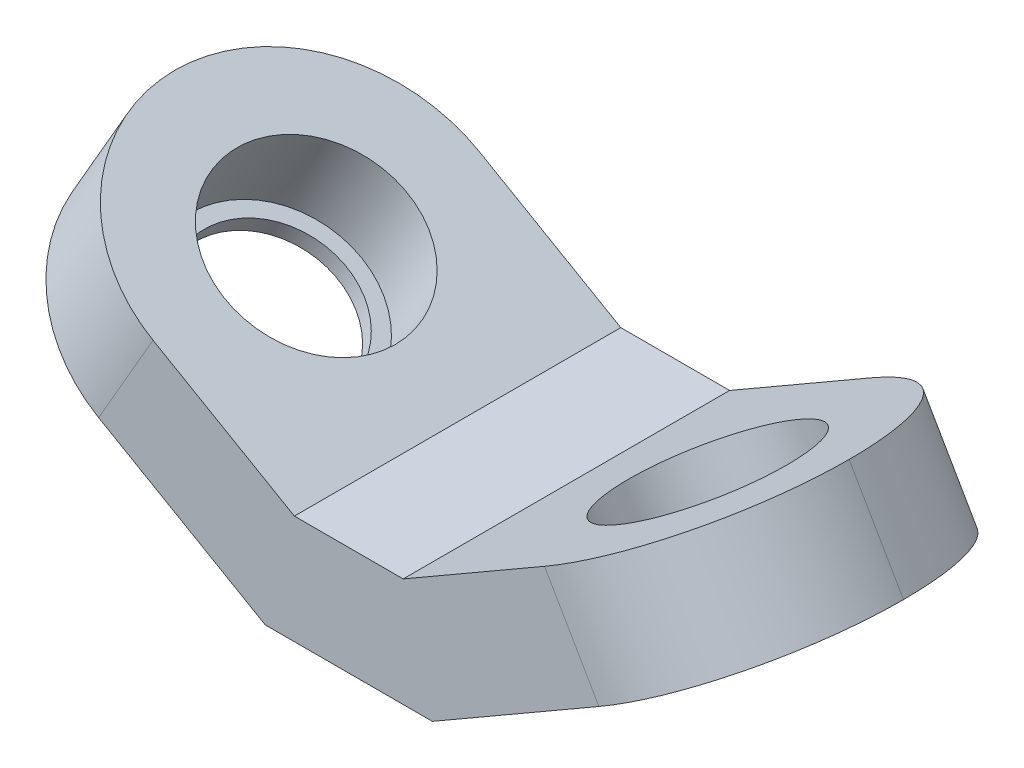
ISO-10303-21;
HEADER;
FILE_DESCRIPTION(('STEP AP214'),'2;1');
FILE_NAME('part.step','',(''),(''),'','','');
FILE_SCHEMA(('AUTOMOTIVE_DESIGN { 1 0 10303 214 1 1 1 1 }'));
ENDSEC;
DATA;
#1=APPLICATION_CONTEXT('core data for automotive mechanical design processes');
#2=APPLICATION_PROTOCOL_DEFINITION('international standard','automotive_design',2000,#1);
#3=PRODUCT_CONTEXT('',#1,'mechanical');
#4=PRODUCT('Part','Part','',(#3));
#5=PRODUCT_RELATED_PRODUCT_CATEGORY('part','',(#4));
#6=PRODUCT_DEFINITION_FORMATION('','',#4);
#7=PRODUCT_DEFINITION_CONTEXT('part definition',#1,'design');
#8=PRODUCT_DEFINITION('design','',#6,#7);
#9=PRODUCT_DEFINITION_SHAPE('','',#8);
#10=(LENGTH_UNIT() NAMED_UNIT(*) SI_UNIT(.MILLI.,.METRE.));
#11=(NAMED_UNIT(*) PLANE_ANGLE_UNIT() SI_UNIT($,.RADIAN.));
#12=(NAMED_UNIT(*) SI_UNIT($,.STERADIAN.) SOLID_ANGLE_UNIT());
#13=UNCERTAINTY_MEASURE_WITH_UNIT(LENGTH_MEASURE(1.E-05),#10,'distance_accuracy_value','');
#14=(GEOMETRIC_REPRESENTATION_CONTEXT(3) GLOBAL_UNCERTAINTY_ASSIGNED_CONTEXT((#13)) GLOBAL_UNIT_ASSIGNED_CONTEXT((#10,
#11,#12)) REPRESENTATION_CONTEXT('',''));
#15=CARTESIAN_POINT('',(0.,0.,0.));
#16=DIRECTION('',(0.,0.,1.));
#17=DIRECTION('',(1.,0.,0.));
#18=AXIS2_PLACEMENT_3D('',#15,#16,#17);
#19=CARTESIAN_POINT('',(7.67949192431122,0.,7.5));
#20=DIRECTION('',(0.,1.,0.));
#21=DIRECTION('',(-1.,0.,0.));
#22=AXIS2_PLACEMENT_3D('',#19,#20,#21);
#23=PLANE('',#22);
#24=DIRECTION('',(1.,0.,0.));
#25=VECTOR('',#24,1.);
#26=CARTESIAN_POINT('',(7.67949192431122,0.,-7.5));
#27=LINE('',#26,#25);
#28=CARTESIAN_POINT('',(0.,0.,-7.5));
#29=VERTEX_POINT('',#28);
#30=CARTESIAN_POINT('',(7.67949192431122,0.,-7.5));
#31=VERTEX_POINT('',#30);
#32=EDGE_CURVE('E141',#29,#31,#27,.T.);
#33=ORIENTED_EDGE('',*,*,#32,.T.);
#34=DIRECTION('',(0.,0.,-1.));
#35=VECTOR('',#34,1.);
#36=CARTESIAN_POINT('',(7.67949192431122,0.,7.5));
#37=LINE('',#36,#35);
#38=CARTESIAN_POINT('',(7.67949192431122,0.,7.5));
#39=VERTEX_POINT('',#38);
#40=EDGE_CURVE('E123',#39,#31,#37,.T.);
#41=ORIENTED_EDGE('',*,*,#40,.F.);
#42=DIRECTION('',(1.,0.,0.));
#43=VECTOR('',#42,1.);
#44=CARTESIAN_POINT('',(7.67949192431122,0.,7.5));
#45=LINE('',#44,#43);
#46=CARTESIAN_POINT('',(0.,0.,7.5));
#47=VERTEX_POINT('',#46);
#48=EDGE_CURVE('E130',#47,#39,#45,.T.);
#49=ORIENTED_EDGE('',*,*,#48,.F.);
#50=DIRECTION('',(0.,0.,-1.));
#51=VECTOR('',#50,1.);
#52=CARTESIAN_POINT('',(0.,0.,7.5));
#53=LINE('',#52,#51);
#54=EDGE_CURVE('E201',#47,#29,#53,.T.);
#55=ORIENTED_EDGE('',*,*,#54,.T.);
#56=EDGE_LOOP('',(#33,#41,#49,#55));
#57=FACE_BOUND('',#56,.T.);
#58=ADVANCED_FACE('F39',(#57),#23,.F.);
#59=CARTESIAN_POINT('',(21.8301270189222,8.16987298107784,7.5));
#60=DIRECTION('',(-0.500000000000001,0.866025403784438,0.));
#61=DIRECTION('',(-0.866025403784438,-0.500000000000001,0.));
#62=AXIS2_PLACEMENT_3D('',#59,#60,#61);
#63=PLANE('',#62);
#64=DIRECTION('',(0.866025403784438,0.500000000000001,0.));
#65=VECTOR('',#64,1.);
#66=CARTESIAN_POINT('',(21.8301270189222,8.16987298107784,-7.5));
#67=LINE('',#66,#65);
#68=CARTESIAN_POINT('',(15.3349364905389,4.41987298107783,-7.5));
#69=VERTEX_POINT('',#68);
#70=EDGE_CURVE('E203',#31,#69,#67,.T.);
#71=ORIENTED_EDGE('',*,*,#70,.T.);
#72=CARTESIAN_POINT('',(15.3349364905389,4.41987298107783,0.));
#73=DIRECTION('',(-0.500000000000001,0.866025403784438,0.));
#74=DIRECTION('',(-0.866025403784438,-0.500000000000001,0.));
#75=AXIS2_PLACEMENT_3D('',#72,#73,#74);
#76=CIRCLE('',#75,7.5);
#77=CARTESIAN_POINT('',(21.8301270189222,8.16987298107784,0.));
#78=VERTEX_POINT('',#77);
#79=EDGE_CURVE('E165',#69,#78,#76,.F.);
#80=ORIENTED_EDGE('',*,*,#79,.T.);
#81=CARTESIAN_POINT('',(15.3349364905389,4.41987298107783,0.));
#82=DIRECTION('',(-0.500000000000001,0.866025403784438,0.));
#83=DIRECTION('',(-0.866025403784438,-0.500000000000001,0.));
#84=AXIS2_PLACEMENT_3D('',#81,#82,#83);
#85=CIRCLE('',#84,7.5);
#86=CARTESIAN_POINT('',(15.3349364905389,4.41987298107783,7.5));
#87=VERTEX_POINT('',#86);
#88=EDGE_CURVE('E126',#78,#87,#85,.F.);
#89=ORIENTED_EDGE('',*,*,#88,.T.);
#90=DIRECTION('',(0.866025403784438,0.500000000000001,0.));
#91=VECTOR('',#90,1.);
#92=CARTESIAN_POINT('',(21.8301270189222,8.16987298107784,7.5));
#93=LINE('',#92,#91);
#94=EDGE_CURVE('E117',#39,#87,#93,.T.);
#95=ORIENTED_EDGE('',*,*,#94,.F.);
#96=ORIENTED_EDGE('',*,*,#40,.T.);
#97=EDGE_LOOP('',(#71,#80,#89,#95,#96));
#98=FACE_BOUND('',#97,.T.);
#99=CARTESIAN_POINT('',(15.3349364905389,4.41987298107783,0.));
#100=DIRECTION('',(-0.500000000000002,0.866025403784438,0.));
#101=DIRECTION('',(-0.866025403784438,-0.500000000000002,0.));
#102=AXIS2_PLACEMENT_3D('',#99,#100,#101);
#103=CIRCLE('',#102,3.5);
#104=CARTESIAN_POINT('',(18.3660254037844,6.16987298107783,0.));
#105=VERTEX_POINT('',#104);
#106=EDGE_CURVE('E446',#105,#105,#103,.T.);
#107=ORIENTED_EDGE('',*,*,#106,.T.);
#108=EDGE_LOOP('',(#107));
#109=FACE_BOUND('',#108,.T.);
#110=ADVANCED_FACE('F120',(#98,#109),#63,.F.);
#111=CARTESIAN_POINT('',(6.33974596215561,5.,7.5));
#112=DIRECTION('',(0.500000000000002,-0.866025403784437,0.));
#113=DIRECTION('',(0.866025403784438,0.500000000000002,0.));
#114=AXIS2_PLACEMENT_3D('',#111,#112,#113);
#115=PLANE('',#114);
#116=CARTESIAN_POINT('',(12.8349364905389,8.75000000000001,0.));
#117=DIRECTION('',(0.500000000000002,-0.866025403784437,0.));
#118=DIRECTION('',(0.866025403784438,0.500000000000002,0.));
#119=AXIS2_PLACEMENT_3D('',#116,#117,#118);
#120=CIRCLE('',#119,4.2);
#121=CARTESIAN_POINT('',(16.4722431864335,10.85,0.));
#122=VERTEX_POINT('',#121);
#123=EDGE_CURVE('E152',#122,#122,#120,.T.);
#124=ORIENTED_EDGE('',*,*,#123,.T.);
#125=EDGE_LOOP('',(#124));
#126=FACE_BOUND('',#125,.T.);
#127=CARTESIAN_POINT('',(12.8349364905389,8.75000000000001,0.));
#128=DIRECTION('',(0.500000000000002,-0.866025403784437,0.));
#129=DIRECTION('',(0.866025403784438,0.500000000000002,0.));
#130=AXIS2_PLACEMENT_3D('',#127,#128,#129);
#131=CIRCLE('',#130,7.5);
#132=CARTESIAN_POINT('',(12.8349364905389,8.75000000000001,7.5));
#133=VERTEX_POINT('',#132);
#134=CARTESIAN_POINT('',(19.3301270189222,12.5,0.));
#135=VERTEX_POINT('',#134);
#136=EDGE_CURVE('E142',#133,#135,#131,.F.);
#137=ORIENTED_EDGE('',*,*,#136,.T.);
#138=CARTESIAN_POINT('',(12.8349364905389,8.75000000000001,0.));
#139=DIRECTION('',(0.500000000000002,-0.866025403784437,0.));
#140=DIRECTION('',(0.866025403784438,0.500000000000002,0.));
#141=AXIS2_PLACEMENT_3D('',#138,#139,#140);
#142=CIRCLE('',#141,7.5);
#143=CARTESIAN_POINT('',(12.8349364905389,8.75000000000001,-7.5));
#144=VERTEX_POINT('',#143);
#145=EDGE_CURVE('E145',#135,#144,#142,.F.);
#146=ORIENTED_EDGE('',*,*,#145,.T.);
#147=DIRECTION('',(-0.866025403784438,-0.500000000000002,0.));
#148=VECTOR('',#147,1.);
#149=CARTESIAN_POINT('',(6.33974596215561,5.,-7.5));
#150=LINE('',#149,#148);
#151=CARTESIAN_POINT('',(6.33974596215561,5.,-7.5));
#152=VERTEX_POINT('',#151);
#153=EDGE_CURVE('E205',#144,#152,#150,.T.);
#154=ORIENTED_EDGE('',*,*,#153,.T.);
#155=DIRECTION('',(0.,0.,-1.));
#156=VECTOR('',#155,1.);
#157=CARTESIAN_POINT('',(6.33974596215561,5.,7.5));
#158=LINE('',#157,#156);
#159=CARTESIAN_POINT('',(6.33974596215561,5.,7.5));
#160=VERTEX_POINT('',#159);
#161=EDGE_CURVE('E143',#160,#152,#158,.T.);
#162=ORIENTED_EDGE('',*,*,#161,.F.);
#163=DIRECTION('',(-0.866025403784438,-0.500000000000002,0.));
#164=VECTOR('',#163,1.);
#165=CARTESIAN_POINT('',(6.33974596215561,5.,7.5));
#166=LINE('',#165,#164);
#167=EDGE_CURVE('E129',#133,#160,#166,.T.);
#168=ORIENTED_EDGE('',*,*,#167,.F.);
#169=EDGE_LOOP('',(#137,#146,#154,#162,#168));
#170=FACE_BOUND('',#169,.T.);
#171=ADVANCED_FACE('F235',(#126,#170),#115,.F.);
#172=CARTESIAN_POINT('',(1.33974596215561,5.,7.5));
#173=DIRECTION('',(0.,-1.,0.));
#174=DIRECTION('',(1.,0.,0.));
#175=AXIS2_PLACEMENT_3D('',#172,#173,#174);
#176=PLANE('',#175);
#177=DIRECTION('',(-1.,0.,0.));
#178=VECTOR('',#177,1.);
#179=CARTESIAN_POINT('',(1.33974596215561,5.,-7.5));
#180=LINE('',#179,#178);
#181=CARTESIAN_POINT('',(1.33974596215561,5.,-7.5));
#182=VERTEX_POINT('',#181);
#183=EDGE_CURVE('E207',#152,#182,#180,.T.);
#184=ORIENTED_EDGE('',*,*,#183,.T.);
#185=DIRECTION('',(0.,0.,-1.));
#186=VECTOR('',#185,1.);
#187=CARTESIAN_POINT('',(1.33974596215561,5.,7.5));
#188=LINE('',#187,#186);
#189=CARTESIAN_POINT('',(1.33974596215561,5.,7.5));
#190=VERTEX_POINT('',#189);
#191=EDGE_CURVE('E148',#190,#182,#188,.T.);
#192=ORIENTED_EDGE('',*,*,#191,.F.);
#193=DIRECTION('',(-1.,0.,0.));
#194=VECTOR('',#193,1.);
#195=CARTESIAN_POINT('',(1.33974596215561,5.,7.5));
#196=LINE('',#195,#194);
#197=EDGE_CURVE('E195',#160,#190,#196,.T.);
#198=ORIENTED_EDGE('',*,*,#197,.F.);
#199=ORIENTED_EDGE('',*,*,#161,.T.);
#200=EDGE_LOOP('',(#184,#192,#198,#199));
#201=FACE_BOUND('',#200,.T.);
#202=ADVANCED_FACE('F236',(#201),#176,.F.);
#203=CARTESIAN_POINT('',(-11.650635094611,12.5,7.5));
#204=DIRECTION('',(-0.500000000000001,-0.866025403784438,0.));
#205=DIRECTION('',(0.866025403784438,-0.500000000000001,0.));
#206=AXIS2_PLACEMENT_3D('',#203,#204,#205);
#207=PLANE('',#206);
#208=CARTESIAN_POINT('',(-5.15544456622767,8.75000000000001,0.));
#209=DIRECTION('',(-0.500000000000001,-0.866025403784438,0.));
#210=DIRECTION('',(0.866025403784438,-0.500000000000001,0.));
#211=AXIS2_PLACEMENT_3D('',#208,#209,#210);
#212=CIRCLE('',#211,4.2);
#213=CARTESIAN_POINT('',(-1.51813787033303,6.65,0.));
#214=VERTEX_POINT('',#213);
#215=EDGE_CURVE('E154',#214,#214,#212,.T.);
#216=ORIENTED_EDGE('',*,*,#215,.T.);
#217=EDGE_LOOP('',(#216));
#218=FACE_BOUND('',#217,.T.);
#219=DIRECTION('',(-0.866025403784438,0.500000000000001,0.));
#220=VECTOR('',#219,1.);
#221=CARTESIAN_POINT('',(-11.650635094611,12.5,-7.5));
#222=LINE('',#221,#220);
#223=CARTESIAN_POINT('',(-5.15544456622767,8.75000000000001,-7.5));
#224=VERTEX_POINT('',#223);
#225=EDGE_CURVE('E209',#182,#224,#222,.T.);
#226=ORIENTED_EDGE('',*,*,#225,.T.);
#227=CARTESIAN_POINT('',(-5.15544456622767,8.75,0.));
#228=DIRECTION('',(-0.500000000000001,-0.866025403784438,0.));
#229=DIRECTION('',(0.866025403784438,-0.500000000000001,0.));
#230=AXIS2_PLACEMENT_3D('',#227,#228,#229);
#231=CIRCLE('',#230,7.5);
#232=CARTESIAN_POINT('',(-11.650635094611,12.5,0.));
#233=VERTEX_POINT('',#232);
#234=EDGE_CURVE('E11',#224,#233,#231,.F.);
#235=ORIENTED_EDGE('',*,*,#234,.T.);
#236=CARTESIAN_POINT('',(-5.15544456622767,8.75000000000001,0.));
#237=DIRECTION('',(-0.500000000000001,-0.866025403784438,0.));
#238=DIRECTION('',(0.866025403784438,-0.500000000000001,0.));
#239=AXIS2_PLACEMENT_3D('',#236,#237,#238);
#240=CIRCLE('',#239,7.5);
#241=CARTESIAN_POINT('',(-5.15544456622767,8.75000000000001,7.5));
#242=VERTEX_POINT('',#241);
#243=EDGE_CURVE('E48',#233,#242,#240,.F.);
#244=ORIENTED_EDGE('',*,*,#243,.T.);
#245=DIRECTION('',(-0.866025403784438,0.500000000000001,0.));
#246=VECTOR('',#245,1.);
#247=CARTESIAN_POINT('',(-11.650635094611,12.5,7.5));
#248=LINE('',#247,#246);
#249=EDGE_CURVE('E197',#190,#242,#248,.T.);
#250=ORIENTED_EDGE('',*,*,#249,.F.);
#251=ORIENTED_EDGE('',*,*,#191,.T.);
#252=EDGE_LOOP('',(#226,#235,#244,#250,#251));
#253=FACE_BOUND('',#252,.T.);
#254=ADVANCED_FACE('F216',(#218,#253),#207,.F.);
#255=CARTESIAN_POINT('',(0.,0.,7.5));
#256=DIRECTION('',(0.500000000000001,0.866025403784438,0.));
#257=DIRECTION('',(-0.866025403784438,0.500000000000001,0.));
#258=AXIS2_PLACEMENT_3D('',#255,#256,#257);
#259=PLANE('',#258);
#260=CARTESIAN_POINT('',(-7.65544456622767,4.41987298107782,0.));
#261=DIRECTION('',(0.500000000000001,0.866025403784438,0.));
#262=DIRECTION('',(-0.866025403784438,0.500000000000001,0.));
#263=AXIS2_PLACEMENT_3D('',#260,#261,#262);
#264=CIRCLE('',#263,7.5);
#265=CARTESIAN_POINT('',(-7.65544456622767,4.41987298107782,7.5));
#266=VERTEX_POINT('',#265);
#267=CARTESIAN_POINT('',(-14.150635094611,8.16987298107782,0.));
#268=VERTEX_POINT('',#267);
#269=EDGE_CURVE('E62',#266,#268,#264,.F.);
#270=ORIENTED_EDGE('',*,*,#269,.T.);
#271=CARTESIAN_POINT('',(-7.65544456622767,4.41987298107782,0.));
#272=DIRECTION('',(0.500000000000001,0.866025403784438,0.));
#273=DIRECTION('',(-0.866025403784438,0.500000000000001,0.));
#274=AXIS2_PLACEMENT_3D('',#271,#272,#273);
#275=CIRCLE('',#274,7.5);
#276=CARTESIAN_POINT('',(-7.65544456622767,4.41987298107782,-7.5));
#277=VERTEX_POINT('',#276);
#278=EDGE_CURVE('E172',#268,#277,#275,.F.);
#279=ORIENTED_EDGE('',*,*,#278,.T.);
#280=DIRECTION('',(0.866025403784438,-0.500000000000001,0.));
#281=VECTOR('',#280,1.);
#282=CARTESIAN_POINT('',(0.,0.,-7.5));
#283=LINE('',#282,#281);
#284=EDGE_CURVE('E138',#277,#29,#283,.T.);
#285=ORIENTED_EDGE('',*,*,#284,.T.);
#286=ORIENTED_EDGE('',*,*,#54,.F.);
#287=DIRECTION('',(0.866025403784438,-0.500000000000001,0.));
#288=VECTOR('',#287,1.);
#289=CARTESIAN_POINT('',(0.,0.,7.5));
#290=LINE('',#289,#288);
#291=EDGE_CURVE('E134',#266,#47,#290,.T.);
#292=ORIENTED_EDGE('',*,*,#291,.F.);
#293=EDGE_LOOP('',(#270,#279,#285,#286,#292));
#294=FACE_BOUND('',#293,.T.);
#295=CARTESIAN_POINT('',(-7.65544456622768,4.41987298107782,0.));
#296=DIRECTION('',(0.500000000000001,0.866025403784438,0.));
#297=DIRECTION('',(-0.866025403784438,0.500000000000001,0.));
#298=AXIS2_PLACEMENT_3D('',#295,#296,#297);
#299=CIRCLE('',#298,3.5);
#300=CARTESIAN_POINT('',(-4.62435565298214,2.66987298107781,0.));
#301=VERTEX_POINT('',#300);
#302=EDGE_CURVE('E188',#301,#301,#299,.T.);
#303=ORIENTED_EDGE('',*,*,#302,.T.);
#304=EDGE_LOOP('',(#303));
#305=FACE_BOUND('',#304,.T.);
#306=ADVANCED_FACE('F226',(#294,#305),#259,.F.);
#307=CARTESIAN_POINT('',(0.,0.,7.5));
#308=DIRECTION('',(0.,0.,-1.));
#309=DIRECTION('',(-1.,0.,0.));
#310=AXIS2_PLACEMENT_3D('',#307,#308,#309);
#311=PLANE('',#310);
#312=ORIENTED_EDGE('',*,*,#94,.T.);
#313=DIRECTION('',(-0.500000000000002,0.866025403784438,0.));
#314=VECTOR('',#313,1.);
#315=CARTESIAN_POINT('',(13.4150635094611,7.74519052838332,7.5));
#316=LINE('',#315,#314);
#317=EDGE_CURVE('E169',#87,#133,#316,.T.);
#318=ORIENTED_EDGE('',*,*,#317,.T.);
#319=ORIENTED_EDGE('',*,*,#167,.T.);
#320=ORIENTED_EDGE('',*,*,#197,.T.);
#321=ORIENTED_EDGE('',*,*,#249,.T.);
#322=DIRECTION('',(-0.500000000000001,-0.866025403784438,0.));
#323=VECTOR('',#322,1.);
#324=CARTESIAN_POINT('',(-7.65544456622768,4.41987298107782,7.5));
#325=LINE('',#324,#323);
#326=EDGE_CURVE('E167',#242,#266,#325,.T.);
#327=ORIENTED_EDGE('',*,*,#326,.T.);
#328=ORIENTED_EDGE('',*,*,#291,.T.);
#329=ORIENTED_EDGE('',*,*,#48,.T.);
#330=EDGE_LOOP('',(#312,#318,#319,#320,#321,#327,#328,#329));
#331=FACE_BOUND('',#330,.T.);
#332=ADVANCED_FACE('F133',(#331),#311,.F.);
#333=CARTESIAN_POINT('',(0.,0.,-7.5));
#334=DIRECTION('',(0.,0.,-1.));
#335=DIRECTION('',(-1.,0.,0.));
#336=AXIS2_PLACEMENT_3D('',#333,#334,#335);
#337=PLANE('',#336);
#338=ORIENTED_EDGE('',*,*,#153,.F.);
#339=DIRECTION('',(-0.500000000000002,0.866025403784438,0.));
#340=VECTOR('',#339,1.);
#341=CARTESIAN_POINT('',(15.3349364905389,4.41987298107783,-7.5));
#342=LINE('',#341,#340);
#343=EDGE_CURVE('E161',#144,#69,#342,.F.);
#344=ORIENTED_EDGE('',*,*,#343,.T.);
#345=ORIENTED_EDGE('',*,*,#70,.F.);
#346=ORIENTED_EDGE('',*,*,#32,.F.);
#347=ORIENTED_EDGE('',*,*,#284,.F.);
#348=DIRECTION('',(-0.500000000000001,-0.866025403784438,0.));
#349=VECTOR('',#348,1.);
#350=CARTESIAN_POINT('',(-5.15544456622767,8.75000000000001,-7.5));
#351=LINE('',#350,#349);
#352=EDGE_CURVE('E158',#277,#224,#351,.F.);
#353=ORIENTED_EDGE('',*,*,#352,.T.);
#354=ORIENTED_EDGE('',*,*,#225,.F.);
#355=ORIENTED_EDGE('',*,*,#183,.F.);
#356=EDGE_LOOP('',(#338,#344,#345,#346,#347,#353,#354,#355));
#357=FACE_BOUND('',#356,.T.);
#358=ADVANCED_FACE('F222',(#357),#337,.T.);
#359=CARTESIAN_POINT('',(3.21474596215566,23.2475952641917,0.));
#360=DIRECTION('',(-0.500000000000001,-0.866025403784438,0.));
#361=DIRECTION('',(0.866025403784438,-0.500000000000001,0.));
#362=AXIS2_PLACEMENT_3D('',#359,#360,#361);
#363=CYLINDRICAL_SURFACE('',#362,4.2);
#364=CARTESIAN_POINT('',(-7.25544456622768,5.11269330410537,0.));
#365=DIRECTION('',(0.500000000000001,0.866025403784438,0.));
#366=DIRECTION('',(-0.866025403784438,0.500000000000001,0.));
#367=AXIS2_PLACEMENT_3D('',#364,#365,#366);
#368=CIRCLE('',#367,4.2);
#369=CARTESIAN_POINT('',(-10.8927512621223,7.21269330410537,0.));
#370=VERTEX_POINT('',#369);
#371=EDGE_CURVE('E179',#370,#370,#368,.T.);
#372=ORIENTED_EDGE('',*,*,#371,.F.);
#373=EDGE_LOOP('',(#372));
#374=FACE_BOUND('',#373,.T.);
#375=ORIENTED_EDGE('',*,*,#215,.F.);
#376=EDGE_LOOP('',(#375));
#377=FACE_BOUND('',#376,.T.);
#378=ADVANCED_FACE('F260',(#374,#377),#363,.F.);
#379=CARTESIAN_POINT('',(4.46474596215556,23.2475952641917,0.));
#380=DIRECTION('',(0.500000000000001,-0.866025403784438,0.));
#381=DIRECTION('',(0.866025403784438,0.500000000000001,0.));
#382=AXIS2_PLACEMENT_3D('',#379,#380,#381);
#383=CYLINDRICAL_SURFACE('',#382,4.2);
#384=CARTESIAN_POINT('',(14.9349364905389,5.11269330410538,0.));
#385=DIRECTION('',(-0.500000000000002,0.866025403784438,0.));
#386=DIRECTION('',(-0.866025403784438,-0.500000000000002,0.));
#387=AXIS2_PLACEMENT_3D('',#384,#385,#386);
#388=CIRCLE('',#387,4.2);
#389=CARTESIAN_POINT('',(11.2976297946443,3.01269330410537,0.));
#390=VERTEX_POINT('',#389);
#391=EDGE_CURVE('E448',#390,#390,#388,.T.);
#392=ORIENTED_EDGE('',*,*,#391,.F.);
#393=EDGE_LOOP('',(#392));
#394=FACE_BOUND('',#393,.T.);
#395=ORIENTED_EDGE('',*,*,#123,.F.);
#396=EDGE_LOOP('',(#395));
#397=FACE_BOUND('',#396,.T.);
#398=ADVANCED_FACE('F256',(#394,#397),#383,.F.);
#399=CARTESIAN_POINT('',(13.4150635094611,7.74519052838332,0.));
#400=DIRECTION('',(-0.500000000000002,0.866025403784438,0.));
#401=DIRECTION('',(-0.866025403784438,-0.500000000000002,0.));
#402=AXIS2_PLACEMENT_3D('',#399,#400,#401);
#403=CYLINDRICAL_SURFACE('',#402,7.5);
#404=ORIENTED_EDGE('',*,*,#317,.F.);
#405=ORIENTED_EDGE('',*,*,#88,.F.);
#406=DIRECTION('',(-0.500000000000002,0.866025403784438,0.));
#407=VECTOR('',#406,1.);
#408=CARTESIAN_POINT('',(19.3301270189222,12.5,0.));
#409=LINE('',#408,#407);
#410=EDGE_CURVE('E155',#135,#78,#409,.F.);
#411=ORIENTED_EDGE('',*,*,#410,.F.);
#412=ORIENTED_EDGE('',*,*,#136,.F.);
#413=EDGE_LOOP('',(#404,#405,#411,#412));
#414=FACE_BOUND('',#413,.T.);
#415=ADVANCED_FACE('F230',(#414),#403,.T.);
#416=CARTESIAN_POINT('',(12.8349364905389,8.75000000000002,0.));
#417=DIRECTION('',(0.500000000000002,-0.866025403784438,0.));
#418=DIRECTION('',(0.866025403784438,0.500000000000002,0.));
#419=AXIS2_PLACEMENT_3D('',#416,#417,#418);
#420=CYLINDRICAL_SURFACE('',#419,7.5);
#421=ORIENTED_EDGE('',*,*,#79,.F.);
#422=ORIENTED_EDGE('',*,*,#343,.F.);
#423=ORIENTED_EDGE('',*,*,#145,.F.);
#424=ORIENTED_EDGE('',*,*,#410,.T.);
#425=EDGE_LOOP('',(#421,#422,#423,#424));
#426=FACE_BOUND('',#425,.T.);
#427=ADVANCED_FACE('F240',(#426),#420,.T.);
#428=CARTESIAN_POINT('',(-7.65544456622768,4.41987298107782,0.));
#429=DIRECTION('',(-0.500000000000001,-0.866025403784438,0.));
#430=DIRECTION('',(0.866025403784438,-0.500000000000001,0.));
#431=AXIS2_PLACEMENT_3D('',#428,#429,#430);
#432=CYLINDRICAL_SURFACE('',#431,7.5);
#433=ORIENTED_EDGE('',*,*,#326,.F.);
#434=ORIENTED_EDGE('',*,*,#243,.F.);
#435=DIRECTION('',(-0.500000000000001,-0.866025403784438,0.));
#436=VECTOR('',#435,1.);
#437=CARTESIAN_POINT('',(-14.150635094611,8.16987298107782,0.));
#438=LINE('',#437,#436);
#439=EDGE_CURVE('E43',#268,#233,#438,.F.);
#440=ORIENTED_EDGE('',*,*,#439,.F.);
#441=ORIENTED_EDGE('',*,*,#269,.F.);
#442=EDGE_LOOP('',(#433,#434,#440,#441));
#443=FACE_BOUND('',#442,.T.);
#444=ADVANCED_FACE('F41',(#443),#432,.T.);
#445=CARTESIAN_POINT('',(-7.65544456622767,4.41987298107782,0.));
#446=DIRECTION('',(0.500000000000001,0.866025403784438,0.));
#447=DIRECTION('',(-0.866025403784438,0.500000000000001,0.));
#448=AXIS2_PLACEMENT_3D('',#445,#446,#447);
#449=CYLINDRICAL_SURFACE('',#448,7.5);
#450=ORIENTED_EDGE('',*,*,#234,.F.);
#451=ORIENTED_EDGE('',*,*,#352,.F.);
#452=ORIENTED_EDGE('',*,*,#278,.F.);
#453=ORIENTED_EDGE('',*,*,#439,.T.);
#454=EDGE_LOOP('',(#450,#451,#452,#453));
#455=FACE_BOUND('',#454,.T.);
#456=ADVANCED_FACE('F225',(#455),#449,.T.);
#457=CARTESIAN_POINT('',(-7.25544456622768,5.11269330410537,0.));
#458=DIRECTION('',(0.500000000000001,0.866025403784438,0.));
#459=DIRECTION('',(-0.866025403784438,0.500000000000001,0.));
#460=AXIS2_PLACEMENT_3D('',#457,#458,#459);
#461=PLANE('',#460);
#462=ORIENTED_EDGE('',*,*,#371,.T.);
#463=EDGE_LOOP('',(#462));
#464=FACE_BOUND('',#463,.T.);
#465=CARTESIAN_POINT('',(-7.25544456622768,5.11269330410537,0.));
#466=DIRECTION('',(0.500000000000001,0.866025403784438,0.));
#467=DIRECTION('',(-0.866025403784438,0.500000000000001,0.));
#468=AXIS2_PLACEMENT_3D('',#465,#466,#467);
#469=CIRCLE('',#468,3.5);
#470=CARTESIAN_POINT('',(-4.22435565298214,3.36269330410536,0.));
#471=VERTEX_POINT('',#470);
#472=EDGE_CURVE('E183',#471,#471,#469,.T.);
#473=ORIENTED_EDGE('',*,*,#472,.F.);
#474=EDGE_LOOP('',(#473));
#475=FACE_BOUND('',#474,.T.);
#476=ADVANCED_FACE('F245',(#464,#475),#461,.T.);
#477=CARTESIAN_POINT('',(-7.25544456622768,5.11269330410537,0.));
#478=DIRECTION('',(-0.500000000000001,-0.866025403784438,0.));
#479=DIRECTION('',(0.866025403784438,-0.500000000000001,0.));
#480=AXIS2_PLACEMENT_3D('',#477,#478,#479);
#481=CYLINDRICAL_SURFACE('',#480,3.5);
#482=CARTESIAN_POINT('',(-4.22435565298214,3.36269330410536,0.));
#483=CARTESIAN_POINT('',(-4.22852231964881,3.35547642574049,0.));
#484=CARTESIAN_POINT('',(-4.23268898631548,3.34825954737562,0.));
#485=CARTESIAN_POINT('',(-4.24102231964881,3.33382579064588,0.));
#486=CARTESIAN_POINT('',(-4.24518898631548,3.32660891228101,0.));
#487=CARTESIAN_POINT('',(-4.25352231964881,3.31217515555127,0.));
#488=CARTESIAN_POINT('',(-4.25768898631547,3.3049582771864,0.));
#489=CARTESIAN_POINT('',(-4.26602231964881,3.29052452045666,0.));
#490=CARTESIAN_POINT('',(-4.27018898631547,3.28330764209179,0.));
#491=CARTESIAN_POINT('',(-4.27852231964881,3.26887388536205,0.));
#492=CARTESIAN_POINT('',(-4.28268898631547,3.26165700699718,0.));
#493=CARTESIAN_POINT('',(-4.29102231964881,3.24722325026744,0.));
#494=CARTESIAN_POINT('',(-4.29518898631548,3.24000637190257,0.));
#495=CARTESIAN_POINT('',(-4.30352231964881,3.22557261517283,0.));
#496=CARTESIAN_POINT('',(-4.30768898631548,3.21835573680796,0.));
#497=CARTESIAN_POINT('',(-4.31602231964881,3.20392198007822,0.));
#498=CARTESIAN_POINT('',(-4.32018898631547,3.19670510171335,0.));
#499=CARTESIAN_POINT('',(-4.32852231964881,3.18227134498361,0.));
#500=CARTESIAN_POINT('',(-4.33268898631548,3.17505446661874,0.));
#501=CARTESIAN_POINT('',(-4.34102231964881,3.160620709889,0.));
#502=CARTESIAN_POINT('',(-4.34518898631547,3.15340383152413,0.));
#503=CARTESIAN_POINT('',(-4.35352231964881,3.13897007479438,0.));
#504=CARTESIAN_POINT('',(-4.35768898631548,3.13175319642951,0.));
#505=CARTESIAN_POINT('',(-4.36602231964881,3.11731943969977,0.));
#506=CARTESIAN_POINT('',(-4.37018898631548,3.1101025613349,0.));
#507=CARTESIAN_POINT('',(-4.37852231964881,3.09566880460516,0.));
#508=CARTESIAN_POINT('',(-4.38268898631547,3.08845192624029,0.));
#509=CARTESIAN_POINT('',(-4.39102231964881,3.07401816951055,0.));
#510=CARTESIAN_POINT('',(-4.39518898631547,3.06680129114568,0.));
#511=CARTESIAN_POINT('',(-4.40352231964881,3.05236753441594,0.));
#512=CARTESIAN_POINT('',(-4.40768898631548,3.04515065605107,0.));
#513=CARTESIAN_POINT('',(-4.41602231964881,3.03071689932133,0.));
#514=CARTESIAN_POINT('',(-4.42018898631548,3.02350002095646,0.));
#515=CARTESIAN_POINT('',(-4.42852231964881,3.00906626422672,0.));
#516=CARTESIAN_POINT('',(-4.43268898631548,3.00184938586185,0.));
#517=CARTESIAN_POINT('',(-4.44102231964881,2.98741562913211,0.));
#518=CARTESIAN_POINT('',(-4.44518898631548,2.98019875076724,0.));
#519=CARTESIAN_POINT('',(-4.45352231964881,2.9657649940375,0.));
#520=CARTESIAN_POINT('',(-4.45768898631547,2.95854811567263,0.));
#521=CARTESIAN_POINT('',(-4.46602231964881,2.94411435894289,0.));
#522=CARTESIAN_POINT('',(-4.47018898631548,2.93689748057802,0.));
#523=CARTESIAN_POINT('',(-4.47852231964881,2.92246372384827,0.));
#524=CARTESIAN_POINT('',(-4.48268898631548,2.9152468454834,0.));
#525=CARTESIAN_POINT('',(-4.49102231964881,2.90081308875366,0.));
#526=CARTESIAN_POINT('',(-4.49518898631548,2.89359621038879,0.));
#527=CARTESIAN_POINT('',(-4.50352231964881,2.87916245365905,0.));
#528=CARTESIAN_POINT('',(-4.50768898631548,2.87194557529418,0.));
#529=CARTESIAN_POINT('',(-4.51602231964881,2.85751181856444,0.));
#530=CARTESIAN_POINT('',(-4.52018898631547,2.85029494019957,0.));
#531=CARTESIAN_POINT('',(-4.52852231964881,2.83586118346983,0.));
#532=CARTESIAN_POINT('',(-4.53268898631548,2.82864430510496,0.));
#533=CARTESIAN_POINT('',(-4.54102231964881,2.81421054837522,0.));
#534=CARTESIAN_POINT('',(-4.54518898631548,2.80699367001035,0.));
#535=CARTESIAN_POINT('',(-4.55352231964881,2.79255991328061,0.));
#536=CARTESIAN_POINT('',(-4.55768898631548,2.78534303491574,0.));
#537=CARTESIAN_POINT('',(-4.56602231964881,2.770909278186,0.));
#538=CARTESIAN_POINT('',(-4.57018898631548,2.76369239982113,0.));
#539=CARTESIAN_POINT('',(-4.57852231964881,2.74925864309139,0.));
#540=CARTESIAN_POINT('',(-4.58268898631547,2.74204176472652,0.));
#541=CARTESIAN_POINT('',(-4.59102231964881,2.72760800799678,0.));
#542=CARTESIAN_POINT('',(-4.59518898631548,2.72039112963191,0.));
#543=CARTESIAN_POINT('',(-4.60352231964881,2.70595737290217,0.));
#544=CARTESIAN_POINT('',(-4.60768898631548,2.6987404945373,0.));
#545=CARTESIAN_POINT('',(-4.61602231964881,2.68430673780755,0.));
#546=CARTESIAN_POINT('',(-4.62018898631548,2.67708985944268,0.));
#547=CARTESIAN_POINT('',(-4.62435565298214,2.66987298107781,0.));
#548=B_SPLINE_CURVE_WITH_KNOTS('',3,(#482,#483,#484,#485,#486,#487,#488,#489,#490,#491,#492,
#493,#494,#495,#496,#497,#498,#499,#500,#501,#502,#503,#504,#505,#506,#507,#508,#509,#510,#511,
#512,#513,#514,#515,#516,#517,#518,#519,#520,#521,#522,#523,#524,#525,#526,#527,#528,#529,#530,
#531,#532,#533,#534,#535,#536,#537,#538,#539,#540,#541,#542,#543,#544,#545,#546,#547),
.UNSPECIFIED.,.F.,.F.,(4,2,2,2,2,2,2,2,2,2,2,2,2,2,2,2,2,2,2,2,2,2,2,2,2,2,2,2,2,2,2,2,4),(0.,
0.0250000000000004,0.05,0.0750000000000001,0.1,0.125,0.15,0.175,0.2,0.225,0.25,0.275,0.3,0.325,
0.35,0.375,0.4,0.425000000000001,0.45,0.475,0.5,0.525,0.55,0.575,0.6,0.625,0.65,0.675,0.7,
0.725000000000001,0.75,0.775,0.800000000000001),.UNSPECIFIED.);
#549=EDGE_CURVE('BSEAM326',#471,#301,#548,.T.);
#550=ORIENTED_EDGE('',*,*,#472,.T.);
#551=ORIENTED_EDGE('',*,*,#302,.F.);
#552=ORIENTED_EDGE('',*,*,#549,.T.);
#553=ORIENTED_EDGE('',*,*,#549,.F.);
#554=EDGE_LOOP('',(#550,#552,#551,#553));
#555=FACE_BOUND('',#554,.T.);
#556=ADVANCED_FACE('F326',(#555),#481,.F.);
#557=CARTESIAN_POINT('',(14.9349364905389,5.11269330410538,0.));
#558=DIRECTION('',(-0.500000000000002,0.866025403784438,0.));
#559=DIRECTION('',(-0.866025403784438,-0.500000000000002,0.));
#560=AXIS2_PLACEMENT_3D('',#557,#558,#559);
#561=PLANE('',#560);
#562=ORIENTED_EDGE('',*,*,#391,.T.);
#563=EDGE_LOOP('',(#562));
#564=FACE_BOUND('',#563,.T.);
#565=CARTESIAN_POINT('',(14.9349364905389,5.11269330410538,0.));
#566=DIRECTION('',(-0.500000000000002,0.866025403784438,0.));
#567=DIRECTION('',(-0.866025403784438,-0.500000000000002,0.));
#568=AXIS2_PLACEMENT_3D('',#565,#566,#567);
#569=CIRCLE('',#568,3.5);
#570=CARTESIAN_POINT('',(17.9660254037844,6.86269330410538,0.));
#571=VERTEX_POINT('',#570);
#572=EDGE_CURVE('E443',#571,#571,#569,.T.);
#573=ORIENTED_EDGE('',*,*,#572,.F.);
#574=EDGE_LOOP('',(#573));
#575=FACE_BOUND('',#574,.T.);
#576=ADVANCED_FACE('F334',(#564,#575),#561,.T.);
#577=CARTESIAN_POINT('',(14.9349364905389,5.11269330410538,0.));
#578=DIRECTION('',(0.500000000000002,-0.866025403784438,0.));
#579=DIRECTION('',(0.866025403784438,0.500000000000002,0.));
#580=AXIS2_PLACEMENT_3D('',#577,#578,#579);
#581=CYLINDRICAL_SURFACE('',#580,3.5);
#582=CARTESIAN_POINT('',(17.9660254037844,6.86269330410538,0.));
#583=CARTESIAN_POINT('',(17.9701920704511,6.85547642574051,0.));
#584=CARTESIAN_POINT('',(17.9743587371178,6.84825954737564,0.));
#585=CARTESIAN_POINT('',(17.9826920704511,6.8338257906459,0.));
#586=CARTESIAN_POINT('',(17.9868587371178,6.82660891228103,0.));
#587=CARTESIAN_POINT('',(17.9951920704511,6.81217515555129,0.));
#588=CARTESIAN_POINT('',(17.9993587371178,6.80495827718642,0.));
#589=CARTESIAN_POINT('',(18.0076920704511,6.79052452045668,0.));
#590=CARTESIAN_POINT('',(18.0118587371178,6.78330764209181,0.));
#591=CARTESIAN_POINT('',(18.0201920704511,6.76887388536207,0.));
#592=CARTESIAN_POINT('',(18.0243587371178,6.7616570069972,0.));
#593=CARTESIAN_POINT('',(18.0326920704511,6.74722325026746,0.));
#594=CARTESIAN_POINT('',(18.0368587371178,6.74000637190259,0.));
#595=CARTESIAN_POINT('',(18.0451920704511,6.72557261517285,0.));
#596=CARTESIAN_POINT('',(18.0493587371178,6.71835573680798,0.));
#597=CARTESIAN_POINT('',(18.0576920704511,6.70392198007824,0.));
#598=CARTESIAN_POINT('',(18.0618587371178,6.69670510171337,0.));
#599=CARTESIAN_POINT('',(18.0701920704511,6.68227134498362,0.));
#600=CARTESIAN_POINT('',(18.0743587371178,6.67505446661876,0.));
#601=CARTESIAN_POINT('',(18.0826920704511,6.66062070988901,0.));
#602=CARTESIAN_POINT('',(18.0868587371178,6.65340383152414,0.));
#603=CARTESIAN_POINT('',(18.0951920704511,6.6389700747944,0.));
#604=CARTESIAN_POINT('',(18.0993587371178,6.63175319642953,0.));
#605=CARTESIAN_POINT('',(18.1076920704511,6.61731943969979,0.));
#606=CARTESIAN_POINT('',(18.1118587371178,6.61010256133492,0.));
#607=CARTESIAN_POINT('',(18.1201920704511,6.59566880460518,0.));
#608=CARTESIAN_POINT('',(18.1243587371178,6.58845192624031,0.));
#609=CARTESIAN_POINT('',(18.1326920704511,6.57401816951057,0.));
#610=CARTESIAN_POINT('',(18.1368587371178,6.5668012911457,0.));
#611=CARTESIAN_POINT('',(18.1451920704511,6.55236753441596,0.));
#612=CARTESIAN_POINT('',(18.1493587371178,6.54515065605109,0.));
#613=CARTESIAN_POINT('',(18.1576920704511,6.53071689932135,0.));
#614=CARTESIAN_POINT('',(18.1618587371178,6.52350002095648,0.));
#615=CARTESIAN_POINT('',(18.1701920704511,6.50906626422674,0.));
#616=CARTESIAN_POINT('',(18.1743587371178,6.50184938586187,0.));
#617=CARTESIAN_POINT('',(18.1826920704511,6.48741562913213,0.));
#618=CARTESIAN_POINT('',(18.1868587371178,6.48019875076726,0.));
#619=CARTESIAN_POINT('',(18.1951920704511,6.46576499403752,0.));
#620=CARTESIAN_POINT('',(18.1993587371178,6.45854811567265,0.));
#621=CARTESIAN_POINT('',(18.2076920704511,6.4441143589429,0.));
#622=CARTESIAN_POINT('',(18.2118587371178,6.43689748057803,0.));
#623=CARTESIAN_POINT('',(18.2201920704511,6.42246372384829,0.));
#624=CARTESIAN_POINT('',(18.2243587371178,6.41524684548342,0.));
#625=CARTESIAN_POINT('',(18.2326920704511,6.40081308875368,0.));
#626=CARTESIAN_POINT('',(18.2368587371178,6.39359621038881,0.));
#627=CARTESIAN_POINT('',(18.2451920704511,6.37916245365907,0.));
#628=CARTESIAN_POINT('',(18.2493587371178,6.3719455752942,0.));
#629=CARTESIAN_POINT('',(18.2576920704511,6.35751181856446,0.));
#630=CARTESIAN_POINT('',(18.2618587371178,6.35029494019959,0.));
#631=CARTESIAN_POINT('',(18.2701920704511,6.33586118346985,0.));
#632=CARTESIAN_POINT('',(18.2743587371178,6.32864430510498,0.));
#633=CARTESIAN_POINT('',(18.2826920704511,6.31421054837524,0.));
#634=CARTESIAN_POINT('',(18.2868587371178,6.30699367001037,0.));
#635=CARTESIAN_POINT('',(18.2951920704511,6.29255991328063,0.));
#636=CARTESIAN_POINT('',(18.2993587371178,6.28534303491576,0.));
#637=CARTESIAN_POINT('',(18.3076920704511,6.27090927818602,0.));
#638=CARTESIAN_POINT('',(18.3118587371178,6.26369239982115,0.));
#639=CARTESIAN_POINT('',(18.3201920704511,6.24925864309141,0.));
#640=CARTESIAN_POINT('',(18.3243587371178,6.24204176472654,0.));
#641=CARTESIAN_POINT('',(18.3326920704511,6.2276080079968,0.));
#642=CARTESIAN_POINT('',(18.3368587371178,6.22039112963193,0.));
#643=CARTESIAN_POINT('',(18.3451920704511,6.20595737290218,0.));
#644=CARTESIAN_POINT('',(18.3493587371178,6.19874049453731,0.));
#645=CARTESIAN_POINT('',(18.3576920704511,6.18430673780757,0.));
#646=CARTESIAN_POINT('',(18.3618587371178,6.17708985944271,0.));
#647=CARTESIAN_POINT('',(18.3660254037844,6.16987298107783,0.));
#648=B_SPLINE_CURVE_WITH_KNOTS('',3,(#582,#583,#584,#585,#586,#587,#588,#589,#590,#591,#592,
#593,#594,#595,#596,#597,#598,#599,#600,#601,#602,#603,#604,#605,#606,#607,#608,#609,#610,#611,
#612,#613,#614,#615,#616,#617,#618,#619,#620,#621,#622,#623,#624,#625,#626,#627,#628,#629,#630,
#631,#632,#633,#634,#635,#636,#637,#638,#639,#640,#641,#642,#643,#644,#645,#646,#647),
.UNSPECIFIED.,.F.,.F.,(4,2,2,2,2,2,2,2,2,2,2,2,2,2,2,2,2,2,2,2,2,2,2,2,2,2,2,2,2,2,2,2,4),(0.,
0.0249999999999996,0.0500000000000008,0.0749999999999996,0.100000000000001,0.125,
0.150000000000001,0.175000000000001,0.2,0.225000000000001,0.25,0.275000000000001,0.3,0.325,
0.350000000000001,0.375,0.400000000000001,0.425000000000001,0.45,0.475000000000001,0.5,
0.525000000000001,0.55,0.574999999999999,0.600000000000001,0.625,0.650000000000001,0.675,0.7,
0.725,0.75,0.775000000000001,0.8),.UNSPECIFIED.);
#649=EDGE_CURVE('BSEAM355',#571,#105,#648,.T.);
#650=ORIENTED_EDGE('',*,*,#572,.T.);
#651=ORIENTED_EDGE('',*,*,#106,.F.);
#652=ORIENTED_EDGE('',*,*,#649,.T.);
#653=ORIENTED_EDGE('',*,*,#649,.F.);
#654=EDGE_LOOP('',(#650,#652,#651,#653));
#655=FACE_BOUND('',#654,.T.);
#656=ADVANCED_FACE('F355',(#655),#581,.F.);
#657=CLOSED_SHELL('',(#58,#110,#171,#202,#254,#306,#332,#358,#378,#398,#415,#427,#444,#456,#476,
#556,#576,#656));
#658=MANIFOLD_SOLID_BREP('B2',#657);
#659=ADVANCED_BREP_SHAPE_REPRESENTATION('',(#18,#658),#14);
#660=SHAPE_DEFINITION_REPRESENTATION(#9,#659);
ENDSEC;
END-ISO-10303-21;
